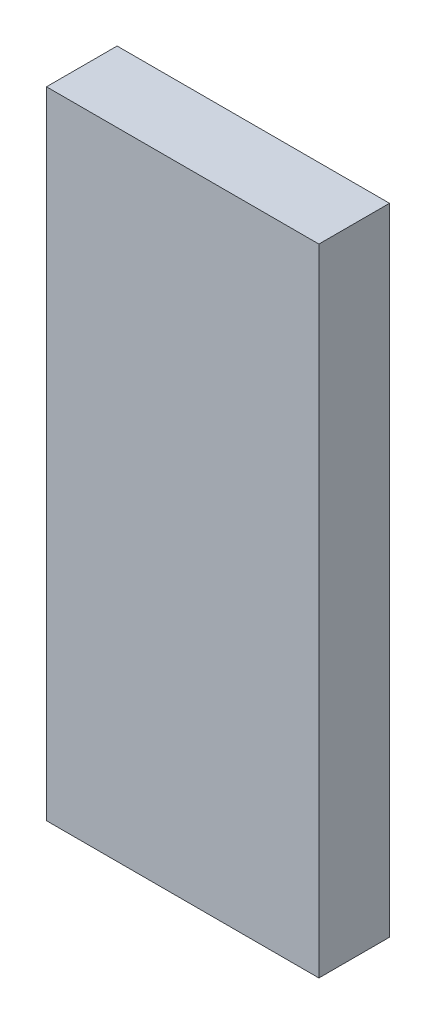
ISO-10303-21;
HEADER;
FILE_DESCRIPTION(('STEP AP214'),'2;1');
FILE_NAME('part.step','',(''),(''),'','','');
FILE_SCHEMA(('AUTOMOTIVE_DESIGN { 1 0 10303 214 1 1 1 1 }'));
ENDSEC;
DATA;
#1=APPLICATION_CONTEXT('core data for automotive mechanical design processes');
#2=APPLICATION_PROTOCOL_DEFINITION('international standard','automotive_design',2000,#1);
#3=PRODUCT_CONTEXT('',#1,'mechanical');
#4=PRODUCT('Part','Part','',(#3));
#5=PRODUCT_RELATED_PRODUCT_CATEGORY('part','',(#4));
#6=PRODUCT_DEFINITION_FORMATION('','',#4);
#7=PRODUCT_DEFINITION_CONTEXT('part definition',#1,'design');
#8=PRODUCT_DEFINITION('design','',#6,#7);
#9=PRODUCT_DEFINITION_SHAPE('','',#8);
#10=(LENGTH_UNIT() NAMED_UNIT(*) SI_UNIT(.MILLI.,.METRE.));
#11=(NAMED_UNIT(*) PLANE_ANGLE_UNIT() SI_UNIT($,.RADIAN.));
#12=(NAMED_UNIT(*) SI_UNIT($,.STERADIAN.) SOLID_ANGLE_UNIT());
#13=UNCERTAINTY_MEASURE_WITH_UNIT(LENGTH_MEASURE(1.E-05),#10,'distance_accuracy_value','');
#14=(GEOMETRIC_REPRESENTATION_CONTEXT(3) GLOBAL_UNCERTAINTY_ASSIGNED_CONTEXT((#13)) GLOBAL_UNIT_ASSIGNED_CONTEXT((#10,
#11,#12)) REPRESENTATION_CONTEXT('',''));
#15=CARTESIAN_POINT('',(0.,0.,0.));
#16=DIRECTION('',(0.,0.,1.));
#17=DIRECTION('',(1.,0.,0.));
#18=AXIS2_PLACEMENT_3D('',#15,#16,#17);
#19=CARTESIAN_POINT('',(0.67499992,-1.57500066,0.));
#20=DIRECTION('',(-1.,0.,0.));
#21=DIRECTION('',(0.,1.,0.));
#22=AXIS2_PLACEMENT_3D('',#19,#20,#21);
#23=PLANE('',#22);
#24=DIRECTION('',(0.,1.,0.));
#25=VECTOR('',#24,1.);
#26=CARTESIAN_POINT('',(0.67499992,-1.57500066,0.));
#27=LINE('',#26,#25);
#28=CARTESIAN_POINT('',(0.67499992,-1.57500066,0.));
#29=VERTEX_POINT('',#28);
#30=CARTESIAN_POINT('',(0.67499992,1.57500066,0.));
#31=VERTEX_POINT('',#30);
#32=EDGE_CURVE('E11',#29,#31,#27,.T.);
#33=ORIENTED_EDGE('',*,*,#32,.T.);
#34=DIRECTION('',(0.,0.,1.));
#35=VECTOR('',#34,1.);
#36=CARTESIAN_POINT('',(0.67499992,1.57500066,0.));
#37=LINE('',#36,#35);
#38=CARTESIAN_POINT('',(0.67499992,1.57500066,0.35000184));
#39=VERTEX_POINT('',#38);
#40=EDGE_CURVE('E24',#31,#39,#37,.T.);
#41=ORIENTED_EDGE('',*,*,#40,.T.);
#42=DIRECTION('',(0.,1.,0.));
#43=VECTOR('',#42,1.);
#44=CARTESIAN_POINT('',(0.67499992,-1.57500066,0.35000184));
#45=LINE('',#44,#43);
#46=CARTESIAN_POINT('',(0.67499992,-1.57500066,0.35000184));
#47=VERTEX_POINT('',#46);
#48=EDGE_CURVE('E87',#47,#39,#45,.T.);
#49=ORIENTED_EDGE('',*,*,#48,.F.);
#50=DIRECTION('',(0.,0.,1.));
#51=VECTOR('',#50,1.);
#52=CARTESIAN_POINT('',(0.67499992,-1.57500066,0.));
#53=LINE('',#52,#51);
#54=EDGE_CURVE('E36',#29,#47,#53,.T.);
#55=ORIENTED_EDGE('',*,*,#54,.F.);
#56=EDGE_LOOP('',(#33,#41,#49,#55));
#57=FACE_BOUND('',#56,.T.);
#58=ADVANCED_FACE('F17',(#57),#23,.F.);
#59=CARTESIAN_POINT('',(0.67499992,1.57500066,0.));
#60=DIRECTION('',(0.,-1.,0.));
#61=DIRECTION('',(-1.,0.,0.));
#62=AXIS2_PLACEMENT_3D('',#59,#60,#61);
#63=PLANE('',#62);
#64=DIRECTION('',(-1.,0.,0.));
#65=VECTOR('',#64,1.);
#66=CARTESIAN_POINT('',(0.67499992,1.57500066,0.));
#67=LINE('',#66,#65);
#68=CARTESIAN_POINT('',(-0.67499992,1.57500066,0.));
#69=VERTEX_POINT('',#68);
#70=EDGE_CURVE('E84',#31,#69,#67,.T.);
#71=ORIENTED_EDGE('',*,*,#70,.T.);
#72=DIRECTION('',(0.,0.,1.));
#73=VECTOR('',#72,1.);
#74=CARTESIAN_POINT('',(-0.67499992,1.57500066,0.));
#75=LINE('',#74,#73);
#76=CARTESIAN_POINT('',(-0.67499992,1.57500066,0.35000184));
#77=VERTEX_POINT('',#76);
#78=EDGE_CURVE('E82',#69,#77,#75,.T.);
#79=ORIENTED_EDGE('',*,*,#78,.T.);
#80=DIRECTION('',(-1.,0.,0.));
#81=VECTOR('',#80,1.);
#82=CARTESIAN_POINT('',(0.67499992,1.57500066,0.35000184));
#83=LINE('',#82,#81);
#84=EDGE_CURVE('E62',#39,#77,#83,.T.);
#85=ORIENTED_EDGE('',*,*,#84,.F.);
#86=ORIENTED_EDGE('',*,*,#40,.F.);
#87=EDGE_LOOP('',(#71,#79,#85,#86));
#88=FACE_BOUND('',#87,.T.);
#89=ADVANCED_FACE('F89',(#88),#63,.F.);
#90=CARTESIAN_POINT('',(-0.67499992,1.57500066,0.));
#91=DIRECTION('',(1.,0.,0.));
#92=DIRECTION('',(0.,-1.,0.));
#93=AXIS2_PLACEMENT_3D('',#90,#91,#92);
#94=PLANE('',#93);
#95=DIRECTION('',(0.,-1.,0.));
#96=VECTOR('',#95,1.);
#97=CARTESIAN_POINT('',(-0.67499992,1.57500066,0.));
#98=LINE('',#97,#96);
#99=CARTESIAN_POINT('',(-0.67499992,-1.57500066,0.));
#100=VERTEX_POINT('',#99);
#101=EDGE_CURVE('E71',#69,#100,#98,.T.);
#102=ORIENTED_EDGE('',*,*,#101,.T.);
#103=DIRECTION('',(0.,0.,1.));
#104=VECTOR('',#103,1.);
#105=CARTESIAN_POINT('',(-0.67499992,-1.57500066,0.));
#106=LINE('',#105,#104);
#107=CARTESIAN_POINT('',(-0.67499992,-1.57500066,0.35000184));
#108=VERTEX_POINT('',#107);
#109=EDGE_CURVE('E65',#100,#108,#106,.T.);
#110=ORIENTED_EDGE('',*,*,#109,.T.);
#111=DIRECTION('',(0.,-1.,0.));
#112=VECTOR('',#111,1.);
#113=CARTESIAN_POINT('',(-0.67499992,1.57500066,0.35000184));
#114=LINE('',#113,#112);
#115=EDGE_CURVE('E57',#77,#108,#114,.T.);
#116=ORIENTED_EDGE('',*,*,#115,.F.);
#117=ORIENTED_EDGE('',*,*,#78,.F.);
#118=EDGE_LOOP('',(#102,#110,#116,#117));
#119=FACE_BOUND('',#118,.T.);
#120=ADVANCED_FACE('F69',(#119),#94,.F.);
#121=CARTESIAN_POINT('',(-0.67499992,-1.57500066,0.));
#122=DIRECTION('',(0.,1.,0.));
#123=DIRECTION('',(1.,0.,0.));
#124=AXIS2_PLACEMENT_3D('',#121,#122,#123);
#125=PLANE('',#124);
#126=DIRECTION('',(1.,0.,0.));
#127=VECTOR('',#126,1.);
#128=CARTESIAN_POINT('',(-0.67499992,-1.57500066,0.));
#129=LINE('',#128,#127);
#130=EDGE_CURVE('E66',#100,#29,#129,.T.);
#131=ORIENTED_EDGE('',*,*,#130,.T.);
#132=ORIENTED_EDGE('',*,*,#54,.T.);
#133=DIRECTION('',(1.,0.,0.));
#134=VECTOR('',#133,1.);
#135=CARTESIAN_POINT('',(-0.67499992,-1.57500066,0.35000184));
#136=LINE('',#135,#134);
#137=EDGE_CURVE('E61',#108,#47,#136,.T.);
#138=ORIENTED_EDGE('',*,*,#137,.F.);
#139=ORIENTED_EDGE('',*,*,#109,.F.);
#140=EDGE_LOOP('',(#131,#132,#138,#139));
#141=FACE_BOUND('',#140,.T.);
#142=ADVANCED_FACE('F76',(#141),#125,.F.);
#143=CARTESIAN_POINT('',(0.,0.,0.));
#144=DIRECTION('',(0.,0.,1.));
#145=DIRECTION('',(1.,0.,0.));
#146=AXIS2_PLACEMENT_3D('',#143,#144,#145);
#147=PLANE('',#146);
#148=ORIENTED_EDGE('',*,*,#130,.F.);
#149=ORIENTED_EDGE('',*,*,#101,.F.);
#150=ORIENTED_EDGE('',*,*,#70,.F.);
#151=ORIENTED_EDGE('',*,*,#32,.F.);
#152=EDGE_LOOP('',(#148,#149,#150,#151));
#153=FACE_BOUND('',#152,.T.);
#154=ADVANCED_FACE('F91',(#153),#147,.F.);
#155=CARTESIAN_POINT('',(0.,0.,0.35000184));
#156=DIRECTION('',(0.,0.,1.));
#157=DIRECTION('',(1.,0.,0.));
#158=AXIS2_PLACEMENT_3D('',#155,#156,#157);
#159=PLANE('',#158);
#160=ORIENTED_EDGE('',*,*,#48,.T.);
#161=ORIENTED_EDGE('',*,*,#84,.T.);
#162=ORIENTED_EDGE('',*,*,#115,.T.);
#163=ORIENTED_EDGE('',*,*,#137,.T.);
#164=EDGE_LOOP('',(#160,#161,#162,#163));
#165=FACE_BOUND('',#164,.T.);
#166=ADVANCED_FACE('F59',(#165),#159,.T.);
#167=CLOSED_SHELL('',(#58,#89,#120,#142,#154,#166));
#168=MANIFOLD_SOLID_BREP('B1',#167);
#169=ADVANCED_BREP_SHAPE_REPRESENTATION('',(#18,#168),#14);
#170=SHAPE_DEFINITION_REPRESENTATION(#9,#169);
ENDSEC;
END-ISO-10303-21;
